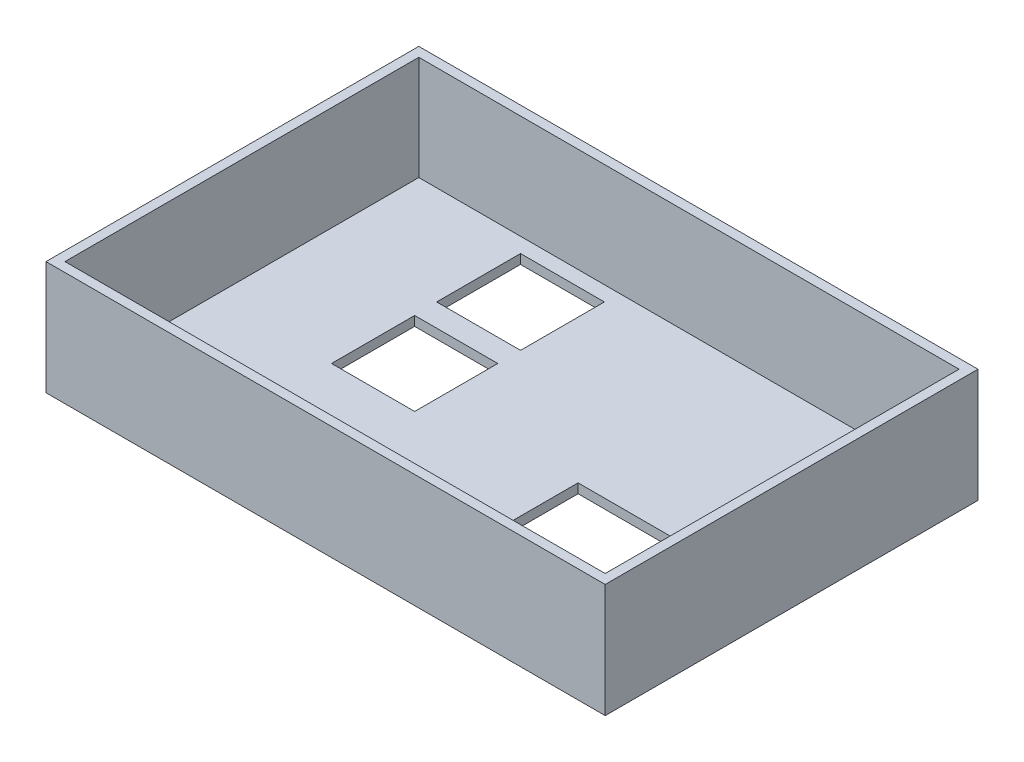
ISO-10303-21;
HEADER;
FILE_DESCRIPTION(('STEP AP214'),'2;1');
FILE_NAME('part.step','',(''),(''),'','','');
FILE_SCHEMA(('AUTOMOTIVE_DESIGN { 1 0 10303 214 1 1 1 1 }'));
ENDSEC;
DATA;
#1=APPLICATION_CONTEXT('core data for automotive mechanical design processes');
#2=APPLICATION_PROTOCOL_DEFINITION('international standard','automotive_design',2000,#1);
#3=PRODUCT_CONTEXT('',#1,'mechanical');
#4=PRODUCT('Part','Part','',(#3));
#5=PRODUCT_RELATED_PRODUCT_CATEGORY('part','',(#4));
#6=PRODUCT_DEFINITION_FORMATION('','',#4);
#7=PRODUCT_DEFINITION_CONTEXT('part definition',#1,'design');
#8=PRODUCT_DEFINITION('design','',#6,#7);
#9=PRODUCT_DEFINITION_SHAPE('','',#8);
#10=(LENGTH_UNIT() NAMED_UNIT(*) SI_UNIT(.MILLI.,.METRE.));
#11=(NAMED_UNIT(*) PLANE_ANGLE_UNIT() SI_UNIT($,.RADIAN.));
#12=(NAMED_UNIT(*) SI_UNIT($,.STERADIAN.) SOLID_ANGLE_UNIT());
#13=UNCERTAINTY_MEASURE_WITH_UNIT(LENGTH_MEASURE(1.E-05),#10,'distance_accuracy_value','');
#14=(GEOMETRIC_REPRESENTATION_CONTEXT(3) GLOBAL_UNCERTAINTY_ASSIGNED_CONTEXT((#13)) GLOBAL_UNIT_ASSIGNED_CONTEXT((#10,
#11,#12)) REPRESENTATION_CONTEXT('',''));
#15=CARTESIAN_POINT('',(0.,0.,0.));
#16=DIRECTION('',(0.,0.,1.));
#17=DIRECTION('',(1.,0.,0.));
#18=AXIS2_PLACEMENT_3D('',#15,#16,#17);
#19=CARTESIAN_POINT('',(0.,0.,0.));
#20=DIRECTION('',(0.,-1.,0.));
#21=DIRECTION('',(0.,0.,-1.));
#22=AXIS2_PLACEMENT_3D('',#19,#20,#21);
#23=PLANE('',#22);
#24=DIRECTION('',(0.,0.,-1.));
#25=VECTOR('',#24,1.);
#26=CARTESIAN_POINT('',(40.6679764243615,0.,-31.335952848723));
#27=LINE('',#26,#25);
#28=CARTESIAN_POINT('',(40.6679764243615,0.,68.664047151277));
#29=VERTEX_POINT('',#28);
#30=CARTESIAN_POINT('',(40.6679764243615,0.,-31.335952848723));
#31=VERTEX_POINT('',#30);
#32=EDGE_CURVE('E287',#29,#31,#27,.T.);
#33=ORIENTED_EDGE('',*,*,#32,.T.);
#34=DIRECTION('',(-1.,0.,0.));
#35=VECTOR('',#34,1.);
#36=CARTESIAN_POINT('',(40.6679764243615,0.,-31.335952848723));
#37=LINE('',#36,#35);
#38=CARTESIAN_POINT('',(-109.332023575639,0.,-31.335952848723));
#39=VERTEX_POINT('',#38);
#40=EDGE_CURVE('E349',#31,#39,#37,.T.);
#41=ORIENTED_EDGE('',*,*,#40,.T.);
#42=DIRECTION('',(0.,0.,1.));
#43=VECTOR('',#42,1.);
#44=CARTESIAN_POINT('',(-109.332023575639,0.,-31.335952848723));
#45=LINE('',#44,#43);
#46=CARTESIAN_POINT('',(-109.332023575638,0.,68.664047151277));
#47=VERTEX_POINT('',#46);
#48=EDGE_CURVE('E353',#39,#47,#45,.T.);
#49=ORIENTED_EDGE('',*,*,#48,.T.);
#50=DIRECTION('',(1.,0.,0.));
#51=VECTOR('',#50,1.);
#52=CARTESIAN_POINT('',(40.6679764243615,0.,68.664047151277));
#53=LINE('',#52,#51);
#54=EDGE_CURVE('E333',#47,#29,#53,.T.);
#55=ORIENTED_EDGE('',*,*,#54,.T.);
#56=EDGE_LOOP('',(#33,#41,#49,#55));
#57=FACE_BOUND('',#56,.T.);
#58=DIRECTION('',(0.,0.,-1.));
#59=VECTOR('',#58,1.);
#60=CARTESIAN_POINT('',(38.1279764243615,0.,-31.335952848723));
#61=LINE('',#60,#59);
#62=CARTESIAN_POINT('',(38.1279764243615,0.,66.124047151277));
#63=VERTEX_POINT('',#62);
#64=CARTESIAN_POINT('',(38.1279764243615,0.,-28.795952848723));
#65=VERTEX_POINT('',#64);
#66=EDGE_CURVE('E274',#63,#65,#61,.T.);
#67=ORIENTED_EDGE('',*,*,#66,.F.);
#68=DIRECTION('',(1.,0.,0.));
#69=VECTOR('',#68,1.);
#70=CARTESIAN_POINT('',(40.6679764243615,0.,66.124047151277));
#71=LINE('',#70,#69);
#72=CARTESIAN_POINT('',(-106.792023575638,0.,66.124047151277));
#73=VERTEX_POINT('',#72);
#74=EDGE_CURVE('E294',#73,#63,#71,.T.);
#75=ORIENTED_EDGE('',*,*,#74,.F.);
#76=DIRECTION('',(0.,0.,1.));
#77=VECTOR('',#76,1.);
#78=CARTESIAN_POINT('',(-106.792023575639,0.,-31.335952848723));
#79=LINE('',#78,#77);
#80=CARTESIAN_POINT('',(-106.792023575639,0.,-28.795952848723));
#81=VERTEX_POINT('',#80);
#82=EDGE_CURVE('E322',#81,#73,#79,.T.);
#83=ORIENTED_EDGE('',*,*,#82,.F.);
#84=DIRECTION('',(-1.,0.,0.));
#85=VECTOR('',#84,1.);
#86=CARTESIAN_POINT('',(40.6679764243615,0.,-28.795952848723));
#87=LINE('',#86,#85);
#88=EDGE_CURVE('E318',#65,#81,#87,.T.);
#89=ORIENTED_EDGE('',*,*,#88,.F.);
#90=EDGE_LOOP('',(#67,#75,#83,#89));
#91=FACE_BOUND('',#90,.T.);
#92=ADVANCED_FACE('F51',(#57,#91),#23,.F.);
#93=CARTESIAN_POINT('',(40.6679764243615,-30.48,-31.335952848723));
#94=DIRECTION('',(1.,0.,0.));
#95=DIRECTION('',(0.,0.,-1.));
#96=AXIS2_PLACEMENT_3D('',#93,#94,#95);
#97=PLANE('',#96);
#98=ORIENTED_EDGE('',*,*,#32,.F.);
#99=DIRECTION('',(0.,1.,0.));
#100=VECTOR('',#99,1.);
#101=CARTESIAN_POINT('',(40.6679764243615,-30.48,68.664047151277));
#102=LINE('',#101,#100);
#103=CARTESIAN_POINT('',(40.6679764243615,-30.48,68.664047151277));
#104=VERTEX_POINT('',#103);
#105=EDGE_CURVE('E360',#104,#29,#102,.T.);
#106=ORIENTED_EDGE('',*,*,#105,.F.);
#107=DIRECTION('',(0.,0.,-1.));
#108=VECTOR('',#107,1.);
#109=CARTESIAN_POINT('',(40.6679764243615,-30.48,-31.335952848723));
#110=LINE('',#109,#108);
#111=CARTESIAN_POINT('',(40.6679764243615,-30.48,-31.335952848723));
#112=VERTEX_POINT('',#111);
#113=EDGE_CURVE('E328',#104,#112,#110,.T.);
#114=ORIENTED_EDGE('',*,*,#113,.T.);
#115=DIRECTION('',(0.,1.,0.));
#116=VECTOR('',#115,1.);
#117=CARTESIAN_POINT('',(40.6679764243615,-30.48,-31.335952848723));
#118=LINE('',#117,#116);
#119=EDGE_CURVE('E345',#112,#31,#118,.T.);
#120=ORIENTED_EDGE('',*,*,#119,.T.);
#121=EDGE_LOOP('',(#98,#106,#114,#120));
#122=FACE_BOUND('',#121,.T.);
#123=ADVANCED_FACE('F53',(#122),#97,.T.);
#124=CARTESIAN_POINT('',(40.6679764243615,-30.48,68.664047151277));
#125=DIRECTION('',(0.,0.,1.));
#126=DIRECTION('',(1.,0.,0.));
#127=AXIS2_PLACEMENT_3D('',#124,#125,#126);
#128=PLANE('',#127);
#129=ORIENTED_EDGE('',*,*,#54,.F.);
#130=DIRECTION('',(0.,1.,0.));
#131=VECTOR('',#130,1.);
#132=CARTESIAN_POINT('',(-109.332023575638,-30.48,68.664047151277));
#133=LINE('',#132,#131);
#134=CARTESIAN_POINT('',(-109.332023575638,-30.48,68.664047151277));
#135=VERTEX_POINT('',#134);
#136=EDGE_CURVE('E364',#135,#47,#133,.T.);
#137=ORIENTED_EDGE('',*,*,#136,.F.);
#138=DIRECTION('',(1.,0.,0.));
#139=VECTOR('',#138,1.);
#140=CARTESIAN_POINT('',(40.6679764243615,-30.48,68.664047151277));
#141=LINE('',#140,#139);
#142=EDGE_CURVE('E341',#135,#104,#141,.T.);
#143=ORIENTED_EDGE('',*,*,#142,.T.);
#144=ORIENTED_EDGE('',*,*,#105,.T.);
#145=EDGE_LOOP('',(#129,#137,#143,#144));
#146=FACE_BOUND('',#145,.T.);
#147=ADVANCED_FACE('F437',(#146),#128,.T.);
#148=CARTESIAN_POINT('',(-109.332023575639,-30.48,-31.335952848723));
#149=DIRECTION('',(-1.,0.,0.));
#150=DIRECTION('',(0.,0.,1.));
#151=AXIS2_PLACEMENT_3D('',#148,#149,#150);
#152=PLANE('',#151);
#153=ORIENTED_EDGE('',*,*,#48,.F.);
#154=DIRECTION('',(0.,1.,0.));
#155=VECTOR('',#154,1.);
#156=CARTESIAN_POINT('',(-109.332023575639,-30.48,-31.335952848723));
#157=LINE('',#156,#155);
#158=CARTESIAN_POINT('',(-109.332023575639,-30.48,-31.335952848723));
#159=VERTEX_POINT('',#158);
#160=EDGE_CURVE('E367',#159,#39,#157,.T.);
#161=ORIENTED_EDGE('',*,*,#160,.F.);
#162=DIRECTION('',(0.,0.,1.));
#163=VECTOR('',#162,1.);
#164=CARTESIAN_POINT('',(-109.332023575639,-30.48,-31.335952848723));
#165=LINE('',#164,#163);
#166=EDGE_CURVE('E337',#159,#135,#165,.T.);
#167=ORIENTED_EDGE('',*,*,#166,.T.);
#168=ORIENTED_EDGE('',*,*,#136,.T.);
#169=EDGE_LOOP('',(#153,#161,#167,#168));
#170=FACE_BOUND('',#169,.T.);
#171=ADVANCED_FACE('F445',(#170),#152,.T.);
#172=CARTESIAN_POINT('',(40.6679764243615,-30.48,-31.335952848723));
#173=DIRECTION('',(0.,0.,-1.));
#174=DIRECTION('',(-1.,0.,0.));
#175=AXIS2_PLACEMENT_3D('',#172,#173,#174);
#176=PLANE('',#175);
#177=ORIENTED_EDGE('',*,*,#40,.F.);
#178=ORIENTED_EDGE('',*,*,#119,.F.);
#179=DIRECTION('',(-1.,0.,0.));
#180=VECTOR('',#179,1.);
#181=CARTESIAN_POINT('',(40.6679764243615,-30.48,-31.335952848723));
#182=LINE('',#181,#180);
#183=EDGE_CURVE('E332',#112,#159,#182,.T.);
#184=ORIENTED_EDGE('',*,*,#183,.T.);
#185=ORIENTED_EDGE('',*,*,#160,.T.);
#186=EDGE_LOOP('',(#177,#178,#184,#185));
#187=FACE_BOUND('',#186,.T.);
#188=ADVANCED_FACE('F448',(#187),#176,.T.);
#189=CARTESIAN_POINT('',(0.,-30.48,0.));
#190=DIRECTION('',(0.,-1.,0.));
#191=DIRECTION('',(0.,0.,-1.));
#192=AXIS2_PLACEMENT_3D('',#189,#190,#191);
#193=PLANE('',#192);
#194=DIRECTION('',(0.,0.,-1.));
#195=VECTOR('',#194,1.);
#196=CARTESIAN_POINT('',(-75.4988485744508,-30.48,-24.7898236808026));
#197=LINE('',#196,#195);
#198=CARTESIAN_POINT('',(-75.4988485744508,-30.48,-2.30053965367364));
#199=VERTEX_POINT('',#198);
#200=CARTESIAN_POINT('',(-75.4988485744508,-30.48,-24.7898236808026));
#201=VERTEX_POINT('',#200);
#202=EDGE_CURVE('E67',#199,#201,#197,.T.);
#203=ORIENTED_EDGE('',*,*,#202,.F.);
#204=DIRECTION('',(-1.,0.,0.));
#205=VECTOR('',#204,1.);
#206=CARTESIAN_POINT('',(-53.0095645473219,-30.48,-2.30053965367364));
#207=LINE('',#206,#205);
#208=CARTESIAN_POINT('',(-53.0095645473219,-30.48,-2.30053965367364));
#209=VERTEX_POINT('',#208);
#210=EDGE_CURVE('E213',#209,#199,#207,.T.);
#211=ORIENTED_EDGE('',*,*,#210,.F.);
#212=DIRECTION('',(0.,0.,1.));
#213=VECTOR('',#212,1.);
#214=CARTESIAN_POINT('',(-53.0095645473219,-30.48,-24.7898236808026));
#215=LINE('',#214,#213);
#216=CARTESIAN_POINT('',(-53.0095645473219,-30.48,-24.7898236808026));
#217=VERTEX_POINT('',#216);
#218=EDGE_CURVE('E195',#217,#209,#215,.T.);
#219=ORIENTED_EDGE('',*,*,#218,.F.);
#220=DIRECTION('',(1.,0.,0.));
#221=VECTOR('',#220,1.);
#222=CARTESIAN_POINT('',(-53.0095645473219,-30.48,-24.7898236808026));
#223=LINE('',#222,#221);
#224=EDGE_CURVE('E205',#201,#217,#223,.T.);
#225=ORIENTED_EDGE('',*,*,#224,.F.);
#226=EDGE_LOOP('',(#203,#211,#219,#225));
#227=FACE_BOUND('',#226,.T.);
#228=DIRECTION('',(-1.,0.,0.));
#229=VECTOR('',#228,1.);
#230=CARTESIAN_POINT('',(-53.0095645473219,-30.48,26.096946109396));
#231=LINE('',#230,#229);
#232=CARTESIAN_POINT('',(-53.0095645473219,-30.48,26.096946109396));
#233=VERTEX_POINT('',#232);
#234=CARTESIAN_POINT('',(-75.3082614216786,-30.48,26.096946109396));
#235=VERTEX_POINT('',#234);
#236=EDGE_CURVE('E223',#233,#235,#231,.T.);
#237=ORIENTED_EDGE('',*,*,#236,.F.);
#238=DIRECTION('',(0.,0.,1.));
#239=VECTOR('',#238,1.);
#240=CARTESIAN_POINT('',(-53.0095645473219,-30.48,3.79824923503931));
#241=LINE('',#240,#239);
#242=CARTESIAN_POINT('',(-53.0095645473219,-30.48,3.79824923503931));
#243=VERTEX_POINT('',#242);
#244=EDGE_CURVE('E238',#243,#233,#241,.T.);
#245=ORIENTED_EDGE('',*,*,#244,.F.);
#246=DIRECTION('',(-1.,0.,0.));
#247=VECTOR('',#246,1.);
#248=CARTESIAN_POINT('',(-53.0095645473219,-30.48,3.79824923503931));
#249=LINE('',#248,#247);
#250=CARTESIAN_POINT('',(-75.3082614216786,-30.48,3.79824923503931));
#251=VERTEX_POINT('',#250);
#252=EDGE_CURVE('E234',#243,#251,#249,.T.);
#253=ORIENTED_EDGE('',*,*,#252,.T.);
#254=DIRECTION('',(0.,0.,1.));
#255=VECTOR('',#254,1.);
#256=CARTESIAN_POINT('',(-75.3082614216786,-30.48,3.79824923503931));
#257=LINE('',#256,#255);
#258=EDGE_CURVE('E230',#251,#235,#257,.T.);
#259=ORIENTED_EDGE('',*,*,#258,.T.);
#260=EDGE_LOOP('',(#237,#245,#253,#259));
#261=FACE_BOUND('',#260,.T.);
#262=DIRECTION('',(0.,0.,-1.));
#263=VECTOR('',#262,1.);
#264=CARTESIAN_POINT('',(-14.5109596873215,-30.48,53.1603218030597));
#265=LINE('',#264,#263);
#266=CARTESIAN_POINT('',(-14.5109596873215,-30.48,53.1603218030597));
#267=VERTEX_POINT('',#266);
#268=CARTESIAN_POINT('',(-14.5109596873215,-30.48,20.7605058317722));
#269=VERTEX_POINT('',#268);
#270=EDGE_CURVE('E246',#267,#269,#265,.T.);
#271=ORIENTED_EDGE('',*,*,#270,.F.);
#272=DIRECTION('',(-1.,0.,0.));
#273=VECTOR('',#272,1.);
#274=CARTESIAN_POINT('',(-14.5109596873215,-30.48,53.1603218030597));
#275=LINE('',#274,#273);
#276=CARTESIAN_POINT('',(29.5146726030751,-30.48,53.1603218030597));
#277=VERTEX_POINT('',#276);
#278=EDGE_CURVE('E266',#277,#267,#275,.T.);
#279=ORIENTED_EDGE('',*,*,#278,.F.);
#280=DIRECTION('',(0.,0.,1.));
#281=VECTOR('',#280,1.);
#282=CARTESIAN_POINT('',(29.5146726030751,-30.48,53.1603218030597));
#283=LINE('',#282,#281);
#284=CARTESIAN_POINT('',(29.5146726030751,-30.48,20.7605058317722));
#285=VERTEX_POINT('',#284);
#286=EDGE_CURVE('E262',#285,#277,#283,.T.);
#287=ORIENTED_EDGE('',*,*,#286,.F.);
#288=DIRECTION('',(1.,0.,0.));
#289=VECTOR('',#288,1.);
#290=CARTESIAN_POINT('',(-14.5109596873215,-30.48,20.7605058317722));
#291=LINE('',#290,#289);
#292=EDGE_CURVE('E258',#269,#285,#291,.T.);
#293=ORIENTED_EDGE('',*,*,#292,.F.);
#294=EDGE_LOOP('',(#271,#279,#287,#293));
#295=FACE_BOUND('',#294,.T.);
#296=ORIENTED_EDGE('',*,*,#113,.F.);
#297=ORIENTED_EDGE('',*,*,#142,.F.);
#298=ORIENTED_EDGE('',*,*,#166,.F.);
#299=ORIENTED_EDGE('',*,*,#183,.F.);
#300=EDGE_LOOP('',(#296,#297,#298,#299));
#301=FACE_BOUND('',#300,.T.);
#302=ADVANCED_FACE('F210',(#227,#261,#295,#301),#193,.T.);
#303=CARTESIAN_POINT('',(38.1279764243615,-30.48,-31.335952848723));
#304=DIRECTION('',(1.,0.,0.));
#305=DIRECTION('',(0.,0.,-1.));
#306=AXIS2_PLACEMENT_3D('',#303,#304,#305);
#307=PLANE('',#306);
#308=ORIENTED_EDGE('',*,*,#66,.T.);
#309=DIRECTION('',(0.,1.,0.));
#310=VECTOR('',#309,1.);
#311=CARTESIAN_POINT('',(38.1279764243615,-30.48,-28.795952848723));
#312=LINE('',#311,#310);
#313=CARTESIAN_POINT('',(38.1279764243615,-27.94,-28.795952848723));
#314=VERTEX_POINT('',#313);
#315=EDGE_CURVE('E295',#314,#65,#312,.T.);
#316=ORIENTED_EDGE('',*,*,#315,.F.);
#317=DIRECTION('',(0.,0.,-1.));
#318=VECTOR('',#317,1.);
#319=CARTESIAN_POINT('',(38.1279764243615,-27.94,-31.335952848723));
#320=LINE('',#319,#318);
#321=CARTESIAN_POINT('',(38.1279764243615,-27.94,66.124047151277));
#322=VERTEX_POINT('',#321);
#323=EDGE_CURVE('E289',#322,#314,#320,.T.);
#324=ORIENTED_EDGE('',*,*,#323,.F.);
#325=DIRECTION('',(0.,1.,0.));
#326=VECTOR('',#325,1.);
#327=CARTESIAN_POINT('',(38.1279764243615,-30.48,66.124047151277));
#328=LINE('',#327,#326);
#329=EDGE_CURVE('E284',#322,#63,#328,.T.);
#330=ORIENTED_EDGE('',*,*,#329,.T.);
#331=EDGE_LOOP('',(#308,#316,#324,#330));
#332=FACE_BOUND('',#331,.T.);
#333=ADVANCED_FACE('F455',(#332),#307,.F.);
#334=CARTESIAN_POINT('',(40.6679764243615,-30.48,66.124047151277));
#335=DIRECTION('',(0.,0.,1.));
#336=DIRECTION('',(1.,0.,0.));
#337=AXIS2_PLACEMENT_3D('',#334,#335,#336);
#338=PLANE('',#337);
#339=ORIENTED_EDGE('',*,*,#74,.T.);
#340=ORIENTED_EDGE('',*,*,#329,.F.);
#341=DIRECTION('',(1.,0.,0.));
#342=VECTOR('',#341,1.);
#343=CARTESIAN_POINT('',(40.6679764243615,-27.94,66.124047151277));
#344=LINE('',#343,#342);
#345=CARTESIAN_POINT('',(-106.792023575638,-27.94,66.124047151277));
#346=VERTEX_POINT('',#345);
#347=EDGE_CURVE('E299',#346,#322,#344,.T.);
#348=ORIENTED_EDGE('',*,*,#347,.F.);
#349=DIRECTION('',(0.,1.,0.));
#350=VECTOR('',#349,1.);
#351=CARTESIAN_POINT('',(-106.792023575638,-30.48,66.124047151277));
#352=LINE('',#351,#350);
#353=EDGE_CURVE('E288',#346,#73,#352,.T.);
#354=ORIENTED_EDGE('',*,*,#353,.T.);
#355=EDGE_LOOP('',(#339,#340,#348,#354));
#356=FACE_BOUND('',#355,.T.);
#357=ADVANCED_FACE('F466',(#356),#338,.F.);
#358=CARTESIAN_POINT('',(-106.792023575639,-30.48,-31.335952848723));
#359=DIRECTION('',(-1.,0.,0.));
#360=DIRECTION('',(0.,0.,1.));
#361=AXIS2_PLACEMENT_3D('',#358,#359,#360);
#362=PLANE('',#361);
#363=ORIENTED_EDGE('',*,*,#82,.T.);
#364=ORIENTED_EDGE('',*,*,#353,.F.);
#365=DIRECTION('',(0.,0.,1.));
#366=VECTOR('',#365,1.);
#367=CARTESIAN_POINT('',(-106.792023575639,-27.94,-31.335952848723));
#368=LINE('',#367,#366);
#369=CARTESIAN_POINT('',(-106.792023575639,-27.94,-28.795952848723));
#370=VERTEX_POINT('',#369);
#371=EDGE_CURVE('E306',#370,#346,#368,.T.);
#372=ORIENTED_EDGE('',*,*,#371,.F.);
#373=DIRECTION('',(0.,1.,0.));
#374=VECTOR('',#373,1.);
#375=CARTESIAN_POINT('',(-106.792023575638,-30.48,-28.795952848723));
#376=LINE('',#375,#374);
#377=EDGE_CURVE('E298',#370,#81,#376,.T.);
#378=ORIENTED_EDGE('',*,*,#377,.T.);
#379=EDGE_LOOP('',(#363,#364,#372,#378));
#380=FACE_BOUND('',#379,.T.);
#381=ADVANCED_FACE('F473',(#380),#362,.F.);
#382=CARTESIAN_POINT('',(40.6679764243615,-30.48,-28.795952848723));
#383=DIRECTION('',(0.,0.,-1.));
#384=DIRECTION('',(-1.,0.,0.));
#385=AXIS2_PLACEMENT_3D('',#382,#383,#384);
#386=PLANE('',#385);
#387=ORIENTED_EDGE('',*,*,#88,.T.);
#388=ORIENTED_EDGE('',*,*,#377,.F.);
#389=DIRECTION('',(-1.,0.,0.));
#390=VECTOR('',#389,1.);
#391=CARTESIAN_POINT('',(40.6679764243615,-27.94,-28.795952848723));
#392=LINE('',#391,#390);
#393=EDGE_CURVE('E293',#314,#370,#392,.T.);
#394=ORIENTED_EDGE('',*,*,#393,.F.);
#395=ORIENTED_EDGE('',*,*,#315,.T.);
#396=EDGE_LOOP('',(#387,#388,#394,#395));
#397=FACE_BOUND('',#396,.T.);
#398=ADVANCED_FACE('F482',(#397),#386,.F.);
#399=CARTESIAN_POINT('',(0.,-27.94,0.));
#400=DIRECTION('',(0.,-1.,0.));
#401=DIRECTION('',(0.,0.,-1.));
#402=AXIS2_PLACEMENT_3D('',#399,#400,#401);
#403=PLANE('',#402);
#404=DIRECTION('',(-1.,0.,0.));
#405=VECTOR('',#404,1.);
#406=CARTESIAN_POINT('',(0.,-27.94,-2.30053965367363));
#407=LINE('',#406,#405);
#408=CARTESIAN_POINT('',(-53.0095645473219,-27.94,-2.30053965367364));
#409=VERTEX_POINT('',#408);
#410=CARTESIAN_POINT('',(-75.4988485744508,-27.94,-2.30053965367364));
#411=VERTEX_POINT('',#410);
#412=EDGE_CURVE('E60',#409,#411,#407,.T.);
#413=ORIENTED_EDGE('',*,*,#412,.T.);
#414=DIRECTION('',(0.,0.,-1.));
#415=VECTOR('',#414,1.);
#416=CARTESIAN_POINT('',(-75.4988485744508,-27.94,0.));
#417=LINE('',#416,#415);
#418=CARTESIAN_POINT('',(-75.4988485744508,-27.94,-24.7898236808026));
#419=VERTEX_POINT('',#418);
#420=EDGE_CURVE('E11',#411,#419,#417,.T.);
#421=ORIENTED_EDGE('',*,*,#420,.T.);
#422=DIRECTION('',(1.,0.,0.));
#423=VECTOR('',#422,1.);
#424=CARTESIAN_POINT('',(0.,-27.94,-24.7898236808026));
#425=LINE('',#424,#423);
#426=CARTESIAN_POINT('',(-53.0095645473219,-27.94,-24.7898236808026));
#427=VERTEX_POINT('',#426);
#428=EDGE_CURVE('E402',#419,#427,#425,.T.);
#429=ORIENTED_EDGE('',*,*,#428,.T.);
#430=DIRECTION('',(0.,0.,1.));
#431=VECTOR('',#430,1.);
#432=CARTESIAN_POINT('',(-53.0095645473219,-27.94,0.));
#433=LINE('',#432,#431);
#434=EDGE_CURVE('E198',#427,#409,#433,.T.);
#435=ORIENTED_EDGE('',*,*,#434,.T.);
#436=EDGE_LOOP('',(#413,#421,#429,#435));
#437=FACE_BOUND('',#436,.T.);
#438=DIRECTION('',(0.,0.,1.));
#439=VECTOR('',#438,1.);
#440=CARTESIAN_POINT('',(-53.0095645473219,-27.94,0.));
#441=LINE('',#440,#439);
#442=CARTESIAN_POINT('',(-53.0095645473219,-27.94,3.79824923503931));
#443=VERTEX_POINT('',#442);
#444=CARTESIAN_POINT('',(-53.0095645473219,-27.94,26.096946109396));
#445=VERTEX_POINT('',#444);
#446=EDGE_CURVE('E394',#443,#445,#441,.T.);
#447=ORIENTED_EDGE('',*,*,#446,.T.);
#448=DIRECTION('',(-1.,0.,0.));
#449=VECTOR('',#448,1.);
#450=CARTESIAN_POINT('',(0.,-27.94,26.096946109396));
#451=LINE('',#450,#449);
#452=CARTESIAN_POINT('',(-75.3082614216786,-27.94,26.096946109396));
#453=VERTEX_POINT('',#452);
#454=EDGE_CURVE('E398',#445,#453,#451,.T.);
#455=ORIENTED_EDGE('',*,*,#454,.T.);
#456=DIRECTION('',(0.,0.,1.));
#457=VECTOR('',#456,1.);
#458=CARTESIAN_POINT('',(-75.3082614216786,-27.94,0.));
#459=LINE('',#458,#457);
#460=CARTESIAN_POINT('',(-75.3082614216786,-27.94,3.79824923503931));
#461=VERTEX_POINT('',#460);
#462=EDGE_CURVE('E387',#461,#453,#459,.T.);
#463=ORIENTED_EDGE('',*,*,#462,.F.);
#464=DIRECTION('',(-1.,0.,0.));
#465=VECTOR('',#464,1.);
#466=CARTESIAN_POINT('',(0.,-27.94,3.79824923503931));
#467=LINE('',#466,#465);
#468=EDGE_CURVE('E390',#443,#461,#467,.T.);
#469=ORIENTED_EDGE('',*,*,#468,.F.);
#470=EDGE_LOOP('',(#447,#455,#463,#469));
#471=FACE_BOUND('',#470,.T.);
#472=DIRECTION('',(-1.,0.,0.));
#473=VECTOR('',#472,1.);
#474=CARTESIAN_POINT('',(0.,-27.94,53.1603218030597));
#475=LINE('',#474,#473);
#476=CARTESIAN_POINT('',(29.5146726030751,-27.94,53.1603218030597));
#477=VERTEX_POINT('',#476);
#478=CARTESIAN_POINT('',(-14.5109596873215,-27.94,53.1603218030597));
#479=VERTEX_POINT('',#478);
#480=EDGE_CURVE('E379',#477,#479,#475,.T.);
#481=ORIENTED_EDGE('',*,*,#480,.T.);
#482=DIRECTION('',(0.,0.,-1.));
#483=VECTOR('',#482,1.);
#484=CARTESIAN_POINT('',(-14.5109596873215,-27.94,0.));
#485=LINE('',#484,#483);
#486=CARTESIAN_POINT('',(-14.5109596873215,-27.94,20.7605058317722));
#487=VERTEX_POINT('',#486);
#488=EDGE_CURVE('E383',#479,#487,#485,.T.);
#489=ORIENTED_EDGE('',*,*,#488,.T.);
#490=DIRECTION('',(1.,0.,0.));
#491=VECTOR('',#490,1.);
#492=CARTESIAN_POINT('',(0.,-27.94,20.7605058317722));
#493=LINE('',#492,#491);
#494=CARTESIAN_POINT('',(29.5146726030751,-27.94,20.7605058317722));
#495=VERTEX_POINT('',#494);
#496=EDGE_CURVE('E363',#487,#495,#493,.T.);
#497=ORIENTED_EDGE('',*,*,#496,.T.);
#498=DIRECTION('',(0.,0.,1.));
#499=VECTOR('',#498,1.);
#500=CARTESIAN_POINT('',(29.5146726030751,-27.94,0.));
#501=LINE('',#500,#499);
#502=EDGE_CURVE('E375',#495,#477,#501,.T.);
#503=ORIENTED_EDGE('',*,*,#502,.T.);
#504=EDGE_LOOP('',(#481,#489,#497,#503));
#505=FACE_BOUND('',#504,.T.);
#506=ORIENTED_EDGE('',*,*,#323,.T.);
#507=ORIENTED_EDGE('',*,*,#393,.T.);
#508=ORIENTED_EDGE('',*,*,#371,.T.);
#509=ORIENTED_EDGE('',*,*,#347,.T.);
#510=EDGE_LOOP('',(#506,#507,#508,#509));
#511=FACE_BOUND('',#510,.T.);
#512=ADVANCED_FACE('F409',(#437,#471,#505,#511),#403,.F.);
#513=CARTESIAN_POINT('',(-14.5109596873215,0.,53.1603218030597));
#514=DIRECTION('',(-1.,0.,0.));
#515=DIRECTION('',(0.,0.,1.));
#516=AXIS2_PLACEMENT_3D('',#513,#514,#515);
#517=PLANE('',#516);
#518=DIRECTION('',(0.,-1.,0.));
#519=VECTOR('',#518,1.);
#520=CARTESIAN_POINT('',(-14.5109596873215,0.,53.1603218030597));
#521=LINE('',#520,#519);
#522=EDGE_CURVE('E271',#479,#267,#521,.T.);
#523=ORIENTED_EDGE('',*,*,#522,.T.);
#524=ORIENTED_EDGE('',*,*,#270,.T.);
#525=DIRECTION('',(0.,-1.,0.));
#526=VECTOR('',#525,1.);
#527=CARTESIAN_POINT('',(-14.5109596873215,0.,20.7605058317722));
#528=LINE('',#527,#526);
#529=EDGE_CURVE('E270',#487,#269,#528,.T.);
#530=ORIENTED_EDGE('',*,*,#529,.F.);
#531=ORIENTED_EDGE('',*,*,#488,.F.);
#532=EDGE_LOOP('',(#523,#524,#530,#531));
#533=FACE_BOUND('',#532,.T.);
#534=ADVANCED_FACE('F477',(#533),#517,.F.);
#535=CARTESIAN_POINT('',(-14.5109596873215,0.,53.1603218030597));
#536=DIRECTION('',(0.,0.,1.));
#537=DIRECTION('',(1.,0.,0.));
#538=AXIS2_PLACEMENT_3D('',#535,#536,#537);
#539=PLANE('',#538);
#540=DIRECTION('',(0.,-1.,0.));
#541=VECTOR('',#540,1.);
#542=CARTESIAN_POINT('',(29.5146726030751,0.,53.1603218030597));
#543=LINE('',#542,#541);
#544=EDGE_CURVE('E275',#477,#277,#543,.T.);
#545=ORIENTED_EDGE('',*,*,#544,.T.);
#546=ORIENTED_EDGE('',*,*,#278,.T.);
#547=ORIENTED_EDGE('',*,*,#522,.F.);
#548=ORIENTED_EDGE('',*,*,#480,.F.);
#549=EDGE_LOOP('',(#545,#546,#547,#548));
#550=FACE_BOUND('',#549,.T.);
#551=ADVANCED_FACE('F488',(#550),#539,.F.);
#552=CARTESIAN_POINT('',(29.5146726030751,0.,53.1603218030597));
#553=DIRECTION('',(1.,0.,0.));
#554=DIRECTION('',(0.,0.,-1.));
#555=AXIS2_PLACEMENT_3D('',#552,#553,#554);
#556=PLANE('',#555);
#557=DIRECTION('',(0.,-1.,0.));
#558=VECTOR('',#557,1.);
#559=CARTESIAN_POINT('',(29.5146726030751,0.,20.7605058317722));
#560=LINE('',#559,#558);
#561=EDGE_CURVE('E278',#495,#285,#560,.T.);
#562=ORIENTED_EDGE('',*,*,#561,.T.);
#563=ORIENTED_EDGE('',*,*,#286,.T.);
#564=ORIENTED_EDGE('',*,*,#544,.F.);
#565=ORIENTED_EDGE('',*,*,#502,.F.);
#566=EDGE_LOOP('',(#562,#563,#564,#565));
#567=FACE_BOUND('',#566,.T.);
#568=ADVANCED_FACE('F494',(#567),#556,.F.);
#569=CARTESIAN_POINT('',(-14.5109596873215,0.,20.7605058317722));
#570=DIRECTION('',(0.,0.,-1.));
#571=DIRECTION('',(-1.,0.,0.));
#572=AXIS2_PLACEMENT_3D('',#569,#570,#571);
#573=PLANE('',#572);
#574=ORIENTED_EDGE('',*,*,#529,.T.);
#575=ORIENTED_EDGE('',*,*,#292,.T.);
#576=ORIENTED_EDGE('',*,*,#561,.F.);
#577=ORIENTED_EDGE('',*,*,#496,.F.);
#578=EDGE_LOOP('',(#574,#575,#576,#577));
#579=FACE_BOUND('',#578,.T.);
#580=ADVANCED_FACE('F506',(#579),#573,.F.);
#581=CARTESIAN_POINT('',(-53.0095645473219,0.,26.096946109396));
#582=DIRECTION('',(0.,0.,1.));
#583=DIRECTION('',(1.,0.,0.));
#584=AXIS2_PLACEMENT_3D('',#581,#582,#583);
#585=PLANE('',#584);
#586=DIRECTION('',(0.,-1.,0.));
#587=VECTOR('',#586,1.);
#588=CARTESIAN_POINT('',(-53.0095645473219,0.,26.096946109396));
#589=LINE('',#588,#587);
#590=EDGE_CURVE('E243',#445,#233,#589,.T.);
#591=ORIENTED_EDGE('',*,*,#590,.T.);
#592=ORIENTED_EDGE('',*,*,#236,.T.);
#593=DIRECTION('',(0.,-1.,0.));
#594=VECTOR('',#593,1.);
#595=CARTESIAN_POINT('',(-75.3082614216786,0.,26.096946109396));
#596=LINE('',#595,#594);
#597=EDGE_CURVE('E242',#453,#235,#596,.T.);
#598=ORIENTED_EDGE('',*,*,#597,.F.);
#599=ORIENTED_EDGE('',*,*,#454,.F.);
#600=EDGE_LOOP('',(#591,#592,#598,#599));
#601=FACE_BOUND('',#600,.T.);
#602=ADVANCED_FACE('F516',(#601),#585,.F.);
#603=CARTESIAN_POINT('',(-53.0095645473219,0.,3.79824923503931));
#604=DIRECTION('',(1.,0.,0.));
#605=DIRECTION('',(0.,0.,-1.));
#606=AXIS2_PLACEMENT_3D('',#603,#604,#605);
#607=PLANE('',#606);
#608=DIRECTION('',(0.,-1.,0.));
#609=VECTOR('',#608,1.);
#610=CARTESIAN_POINT('',(-53.0095645473219,0.,3.79824923503931));
#611=LINE('',#610,#609);
#612=EDGE_CURVE('E247',#443,#243,#611,.T.);
#613=ORIENTED_EDGE('',*,*,#612,.T.);
#614=ORIENTED_EDGE('',*,*,#244,.T.);
#615=ORIENTED_EDGE('',*,*,#590,.F.);
#616=ORIENTED_EDGE('',*,*,#446,.F.);
#617=EDGE_LOOP('',(#613,#614,#615,#616));
#618=FACE_BOUND('',#617,.T.);
#619=ADVANCED_FACE('F519',(#618),#607,.F.);
#620=CARTESIAN_POINT('',(-53.0095645473219,0.,3.79824923503931));
#621=DIRECTION('',(0.,0.,1.));
#622=DIRECTION('',(1.,0.,0.));
#623=AXIS2_PLACEMENT_3D('',#620,#621,#622);
#624=PLANE('',#623);
#625=ORIENTED_EDGE('',*,*,#468,.T.);
#626=DIRECTION('',(0.,-1.,0.));
#627=VECTOR('',#626,1.);
#628=CARTESIAN_POINT('',(-75.3082614216786,0.,3.79824923503931));
#629=LINE('',#628,#627);
#630=EDGE_CURVE('E250',#461,#251,#629,.T.);
#631=ORIENTED_EDGE('',*,*,#630,.T.);
#632=ORIENTED_EDGE('',*,*,#252,.F.);
#633=ORIENTED_EDGE('',*,*,#612,.F.);
#634=EDGE_LOOP('',(#625,#631,#632,#633));
#635=FACE_BOUND('',#634,.T.);
#636=ADVANCED_FACE('F424',(#635),#624,.T.);
#637=CARTESIAN_POINT('',(-75.3082614216786,0.,3.79824923503931));
#638=DIRECTION('',(1.,0.,0.));
#639=DIRECTION('',(0.,0.,-1.));
#640=AXIS2_PLACEMENT_3D('',#637,#638,#639);
#641=PLANE('',#640);
#642=ORIENTED_EDGE('',*,*,#462,.T.);
#643=ORIENTED_EDGE('',*,*,#597,.T.);
#644=ORIENTED_EDGE('',*,*,#258,.F.);
#645=ORIENTED_EDGE('',*,*,#630,.F.);
#646=EDGE_LOOP('',(#642,#643,#644,#645));
#647=FACE_BOUND('',#646,.T.);
#648=ADVANCED_FACE('F416',(#647),#641,.T.);
#649=CARTESIAN_POINT('',(-75.4988485744508,0.,-24.7898236808026));
#650=DIRECTION('',(-1.,0.,0.));
#651=DIRECTION('',(0.,0.,1.));
#652=AXIS2_PLACEMENT_3D('',#649,#650,#651);
#653=PLANE('',#652);
#654=DIRECTION('',(0.,-1.,0.));
#655=VECTOR('',#654,1.);
#656=CARTESIAN_POINT('',(-75.4988485744508,0.,-2.30053965367364));
#657=LINE('',#656,#655);
#658=EDGE_CURVE('E220',#411,#199,#657,.T.);
#659=ORIENTED_EDGE('',*,*,#658,.T.);
#660=ORIENTED_EDGE('',*,*,#202,.T.);
#661=DIRECTION('',(0.,-1.,0.));
#662=VECTOR('',#661,1.);
#663=CARTESIAN_POINT('',(-75.4988485744508,0.,-24.7898236808026));
#664=LINE('',#663,#662);
#665=EDGE_CURVE('E202',#419,#201,#664,.T.);
#666=ORIENTED_EDGE('',*,*,#665,.F.);
#667=ORIENTED_EDGE('',*,*,#420,.F.);
#668=EDGE_LOOP('',(#659,#660,#666,#667));
#669=FACE_BOUND('',#668,.T.);
#670=ADVANCED_FACE('F414',(#669),#653,.F.);
#671=CARTESIAN_POINT('',(-53.0095645473219,0.,-2.30053965367364));
#672=DIRECTION('',(0.,0.,1.));
#673=DIRECTION('',(1.,0.,0.));
#674=AXIS2_PLACEMENT_3D('',#671,#672,#673);
#675=PLANE('',#674);
#676=DIRECTION('',(0.,-1.,0.));
#677=VECTOR('',#676,1.);
#678=CARTESIAN_POINT('',(-53.0095645473219,0.,-2.30053965367364));
#679=LINE('',#678,#677);
#680=EDGE_CURVE('E201',#409,#209,#679,.T.);
#681=ORIENTED_EDGE('',*,*,#680,.T.);
#682=ORIENTED_EDGE('',*,*,#210,.T.);
#683=ORIENTED_EDGE('',*,*,#658,.F.);
#684=ORIENTED_EDGE('',*,*,#412,.F.);
#685=EDGE_LOOP('',(#681,#682,#683,#684));
#686=FACE_BOUND('',#685,.T.);
#687=ADVANCED_FACE('F413',(#686),#675,.F.);
#688=CARTESIAN_POINT('',(-53.0095645473219,0.,-24.7898236808026));
#689=DIRECTION('',(1.,0.,0.));
#690=DIRECTION('',(0.,0.,-1.));
#691=AXIS2_PLACEMENT_3D('',#688,#689,#690);
#692=PLANE('',#691);
#693=DIRECTION('',(0.,-1.,0.));
#694=VECTOR('',#693,1.);
#695=CARTESIAN_POINT('',(-53.0095645473219,0.,-24.7898236808026));
#696=LINE('',#695,#694);
#697=EDGE_CURVE('E75',#427,#217,#696,.T.);
#698=ORIENTED_EDGE('',*,*,#697,.T.);
#699=ORIENTED_EDGE('',*,*,#218,.T.);
#700=ORIENTED_EDGE('',*,*,#680,.F.);
#701=ORIENTED_EDGE('',*,*,#434,.F.);
#702=EDGE_LOOP('',(#698,#699,#700,#701));
#703=FACE_BOUND('',#702,.T.);
#704=ADVANCED_FACE('F192',(#703),#692,.F.);
#705=CARTESIAN_POINT('',(-53.0095645473219,0.,-24.7898236808026));
#706=DIRECTION('',(0.,0.,-1.));
#707=DIRECTION('',(-1.,0.,0.));
#708=AXIS2_PLACEMENT_3D('',#705,#706,#707);
#709=PLANE('',#708);
#710=ORIENTED_EDGE('',*,*,#665,.T.);
#711=ORIENTED_EDGE('',*,*,#224,.T.);
#712=ORIENTED_EDGE('',*,*,#697,.F.);
#713=ORIENTED_EDGE('',*,*,#428,.F.);
#714=EDGE_LOOP('',(#710,#711,#712,#713));
#715=FACE_BOUND('',#714,.T.);
#716=ADVANCED_FACE('F206',(#715),#709,.F.);
#717=CLOSED_SHELL('',(#92,#123,#147,#171,#188,#302,#333,#357,#381,#398,#512,#534,#551,#568,#580,
#602,#619,#636,#648,#670,#687,#704,#716));
#718=MANIFOLD_SOLID_BREP('B2',#717);
#719=ADVANCED_BREP_SHAPE_REPRESENTATION('',(#18,#718),#14);
#720=SHAPE_DEFINITION_REPRESENTATION(#9,#719);
ENDSEC;
END-ISO-10303-21;
